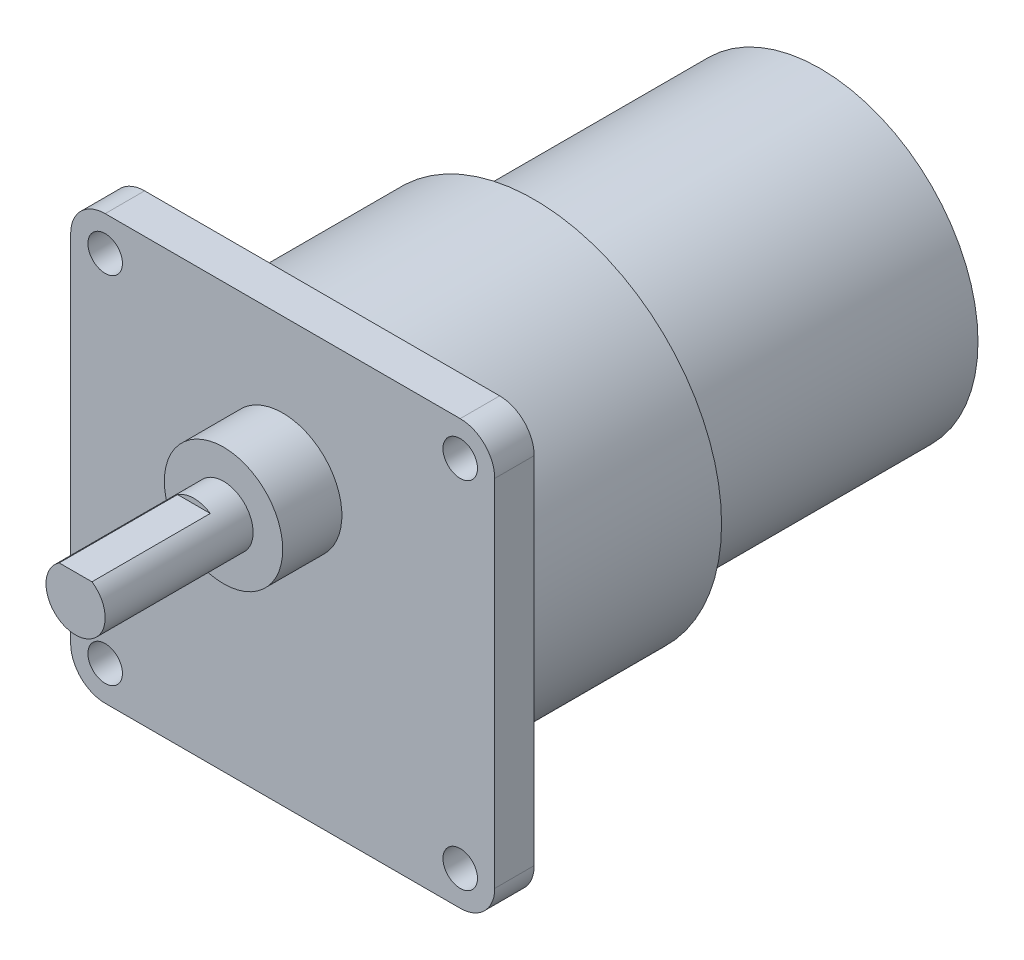
ISO-10303-21;
HEADER;
FILE_DESCRIPTION(('STEP AP214'),'2;1');
FILE_NAME('part.step','',(''),(''),'','','');
FILE_SCHEMA(('AUTOMOTIVE_DESIGN { 1 0 10303 214 1 1 1 1 }'));
ENDSEC;
DATA;
#1=APPLICATION_CONTEXT('core data for automotive mechanical design processes');
#2=APPLICATION_PROTOCOL_DEFINITION('international standard','automotive_design',2000,#1);
#3=PRODUCT_CONTEXT('',#1,'mechanical');
#4=PRODUCT('Part','Part','',(#3));
#5=PRODUCT_RELATED_PRODUCT_CATEGORY('part','',(#4));
#6=PRODUCT_DEFINITION_FORMATION('','',#4);
#7=PRODUCT_DEFINITION_CONTEXT('part definition',#1,'design');
#8=PRODUCT_DEFINITION('design','',#6,#7);
#9=PRODUCT_DEFINITION_SHAPE('','',#8);
#10=(LENGTH_UNIT() NAMED_UNIT(*) SI_UNIT(.MILLI.,.METRE.));
#11=(NAMED_UNIT(*) PLANE_ANGLE_UNIT() SI_UNIT($,.RADIAN.));
#12=(NAMED_UNIT(*) SI_UNIT($,.STERADIAN.) SOLID_ANGLE_UNIT());
#13=UNCERTAINTY_MEASURE_WITH_UNIT(LENGTH_MEASURE(1.E-05),#10,'distance_accuracy_value','');
#14=(GEOMETRIC_REPRESENTATION_CONTEXT(3) GLOBAL_UNCERTAINTY_ASSIGNED_CONTEXT((#13)) GLOBAL_UNIT_ASSIGNED_CONTEXT((#10,
#11,#12)) REPRESENTATION_CONTEXT('',''));
#15=CARTESIAN_POINT('',(0.,0.,0.));
#16=DIRECTION('',(0.,0.,1.));
#17=DIRECTION('',(1.,0.,0.));
#18=AXIS2_PLACEMENT_3D('',#15,#16,#17);
#19=CARTESIAN_POINT('',(21.5,-21.5,4.));
#20=DIRECTION('',(-1.,0.,0.));
#21=DIRECTION('',(0.,0.,1.));
#22=AXIS2_PLACEMENT_3D('',#19,#20,#21);
#23=PLANE('',#22);
#24=DIRECTION('',(0.,1.,0.));
#25=VECTOR('',#24,1.);
#26=CARTESIAN_POINT('',(21.5,-21.5,4.));
#27=LINE('',#26,#25);
#28=CARTESIAN_POINT('',(21.5,-18.,4.));
#29=VERTEX_POINT('',#28);
#30=CARTESIAN_POINT('',(21.5,18.,4.));
#31=VERTEX_POINT('',#30);
#32=EDGE_CURVE('E170',#29,#31,#27,.T.);
#33=ORIENTED_EDGE('',*,*,#32,.F.);
#34=DIRECTION('',(0.,0.,-1.));
#35=VECTOR('',#34,1.);
#36=CARTESIAN_POINT('',(21.5,-18.,4.));
#37=LINE('',#36,#35);
#38=CARTESIAN_POINT('',(21.5,-18.,0.));
#39=VERTEX_POINT('',#38);
#40=EDGE_CURVE('E193',#29,#39,#37,.T.);
#41=ORIENTED_EDGE('',*,*,#40,.T.);
#42=DIRECTION('',(0.,1.,0.));
#43=VECTOR('',#42,1.);
#44=CARTESIAN_POINT('',(21.5,-21.5,0.));
#45=LINE('',#44,#43);
#46=CARTESIAN_POINT('',(21.5,18.,0.));
#47=VERTEX_POINT('',#46);
#48=EDGE_CURVE('E167',#39,#47,#45,.T.);
#49=ORIENTED_EDGE('',*,*,#48,.T.);
#50=DIRECTION('',(0.,0.,-1.));
#51=VECTOR('',#50,1.);
#52=CARTESIAN_POINT('',(21.5,18.,4.));
#53=LINE('',#52,#51);
#54=EDGE_CURVE('E182',#47,#31,#53,.F.);
#55=ORIENTED_EDGE('',*,*,#54,.T.);
#56=EDGE_LOOP('',(#33,#41,#49,#55));
#57=FACE_BOUND('',#56,.T.);
#58=ADVANCED_FACE('F38',(#57),#23,.F.);
#59=CARTESIAN_POINT('',(-21.5,21.5,4.));
#60=DIRECTION('',(0.,-1.,0.));
#61=DIRECTION('',(0.,0.,-1.));
#62=AXIS2_PLACEMENT_3D('',#59,#60,#61);
#63=PLANE('',#62);
#64=DIRECTION('',(-1.,0.,0.));
#65=VECTOR('',#64,1.);
#66=CARTESIAN_POINT('',(-21.5,21.5,0.));
#67=LINE('',#66,#65);
#68=CARTESIAN_POINT('',(18.,21.5,0.));
#69=VERTEX_POINT('',#68);
#70=CARTESIAN_POINT('',(-18.,21.5,0.));
#71=VERTEX_POINT('',#70);
#72=EDGE_CURVE('E185',#69,#71,#67,.T.);
#73=ORIENTED_EDGE('',*,*,#72,.T.);
#74=DIRECTION('',(0.,0.,-1.));
#75=VECTOR('',#74,1.);
#76=CARTESIAN_POINT('',(-18.,21.5,4.));
#77=LINE('',#76,#75);
#78=CARTESIAN_POINT('',(-18.,21.5,4.));
#79=VERTEX_POINT('',#78);
#80=EDGE_CURVE('E223',#71,#79,#77,.F.);
#81=ORIENTED_EDGE('',*,*,#80,.T.);
#82=DIRECTION('',(-1.,0.,0.));
#83=VECTOR('',#82,1.);
#84=CARTESIAN_POINT('',(-21.5,21.5,4.));
#85=LINE('',#84,#83);
#86=CARTESIAN_POINT('',(18.,21.5,4.));
#87=VERTEX_POINT('',#86);
#88=EDGE_CURVE('E173',#87,#79,#85,.T.);
#89=ORIENTED_EDGE('',*,*,#88,.F.);
#90=DIRECTION('',(0.,0.,-1.));
#91=VECTOR('',#90,1.);
#92=CARTESIAN_POINT('',(18.,21.5,4.));
#93=LINE('',#92,#91);
#94=EDGE_CURVE('E221',#87,#69,#93,.T.);
#95=ORIENTED_EDGE('',*,*,#94,.T.);
#96=EDGE_LOOP('',(#73,#81,#89,#95));
#97=FACE_BOUND('',#96,.T.);
#98=ADVANCED_FACE('F265',(#97),#63,.F.);
#99=CARTESIAN_POINT('',(-21.5,-21.5,4.));
#100=DIRECTION('',(1.,0.,0.));
#101=DIRECTION('',(0.,0.,-1.));
#102=AXIS2_PLACEMENT_3D('',#99,#100,#101);
#103=PLANE('',#102);
#104=DIRECTION('',(0.,-1.,0.));
#105=VECTOR('',#104,1.);
#106=CARTESIAN_POINT('',(-21.5,-21.5,0.));
#107=LINE('',#106,#105);
#108=CARTESIAN_POINT('',(-21.5,18.,0.));
#109=VERTEX_POINT('',#108);
#110=CARTESIAN_POINT('',(-21.5,-18.,0.));
#111=VERTEX_POINT('',#110);
#112=EDGE_CURVE('E188',#109,#111,#107,.T.);
#113=ORIENTED_EDGE('',*,*,#112,.T.);
#114=DIRECTION('',(0.,0.,-1.));
#115=VECTOR('',#114,1.);
#116=CARTESIAN_POINT('',(-21.5,-18.,4.));
#117=LINE('',#116,#115);
#118=CARTESIAN_POINT('',(-21.5,-18.,4.));
#119=VERTEX_POINT('',#118);
#120=EDGE_CURVE('E63',#111,#119,#117,.F.);
#121=ORIENTED_EDGE('',*,*,#120,.T.);
#122=DIRECTION('',(0.,-1.,0.));
#123=VECTOR('',#122,1.);
#124=CARTESIAN_POINT('',(-21.5,-21.5,4.));
#125=LINE('',#124,#123);
#126=CARTESIAN_POINT('',(-21.5,18.,4.));
#127=VERTEX_POINT('',#126);
#128=EDGE_CURVE('E177',#127,#119,#125,.T.);
#129=ORIENTED_EDGE('',*,*,#128,.F.);
#130=DIRECTION('',(0.,0.,-1.));
#131=VECTOR('',#130,1.);
#132=CARTESIAN_POINT('',(-21.5,18.,4.));
#133=LINE('',#132,#131);
#134=EDGE_CURVE('E217',#127,#109,#133,.T.);
#135=ORIENTED_EDGE('',*,*,#134,.T.);
#136=EDGE_LOOP('',(#113,#121,#129,#135));
#137=FACE_BOUND('',#136,.T.);
#138=ADVANCED_FACE('F271',(#137),#103,.F.);
#139=CARTESIAN_POINT('',(-21.5,-21.5,4.));
#140=DIRECTION('',(0.,1.,0.));
#141=DIRECTION('',(0.,0.,1.));
#142=AXIS2_PLACEMENT_3D('',#139,#140,#141);
#143=PLANE('',#142);
#144=DIRECTION('',(1.,0.,0.));
#145=VECTOR('',#144,1.);
#146=CARTESIAN_POINT('',(-21.5,-21.5,0.));
#147=LINE('',#146,#145);
#148=CARTESIAN_POINT('',(-18.,-21.5,0.));
#149=VERTEX_POINT('',#148);
#150=CARTESIAN_POINT('',(18.,-21.5,0.));
#151=VERTEX_POINT('',#150);
#152=EDGE_CURVE('E174',#149,#151,#147,.T.);
#153=ORIENTED_EDGE('',*,*,#152,.T.);
#154=DIRECTION('',(0.,0.,-1.));
#155=VECTOR('',#154,1.);
#156=CARTESIAN_POINT('',(18.,-21.5,4.));
#157=LINE('',#156,#155);
#158=CARTESIAN_POINT('',(18.,-21.5,4.));
#159=VERTEX_POINT('',#158);
#160=EDGE_CURVE('E207',#151,#159,#157,.F.);
#161=ORIENTED_EDGE('',*,*,#160,.T.);
#162=DIRECTION('',(1.,0.,0.));
#163=VECTOR('',#162,1.);
#164=CARTESIAN_POINT('',(-21.5,-21.5,4.));
#165=LINE('',#164,#163);
#166=CARTESIAN_POINT('',(-18.,-21.5,4.));
#167=VERTEX_POINT('',#166);
#168=EDGE_CURVE('E179',#167,#159,#165,.T.);
#169=ORIENTED_EDGE('',*,*,#168,.F.);
#170=DIRECTION('',(0.,0.,-1.));
#171=VECTOR('',#170,1.);
#172=CARTESIAN_POINT('',(-18.,-21.5,4.));
#173=LINE('',#172,#171);
#174=EDGE_CURVE('E204',#167,#149,#173,.T.);
#175=ORIENTED_EDGE('',*,*,#174,.T.);
#176=EDGE_LOOP('',(#153,#161,#169,#175));
#177=FACE_BOUND('',#176,.T.);
#178=ADVANCED_FACE('F236',(#177),#143,.F.);
#179=CARTESIAN_POINT('',(0.,0.,4.));
#180=DIRECTION('',(0.,0.,-1.));
#181=DIRECTION('',(-1.,0.,0.));
#182=AXIS2_PLACEMENT_3D('',#179,#180,#181);
#183=PLANE('',#182);
#184=CARTESIAN_POINT('',(0.,7.,4.));
#185=DIRECTION('',(0.,0.,-1.));
#186=DIRECTION('',(-1.,0.,0.));
#187=AXIS2_PLACEMENT_3D('',#184,#185,#186);
#188=CIRCLE('',#187,6.);
#189=CARTESIAN_POINT('',(-6.,7.,4.));
#190=VERTEX_POINT('',#189);
#191=EDGE_CURVE('E42',#190,#190,#188,.F.);
#192=ORIENTED_EDGE('',*,*,#191,.F.);
#193=EDGE_LOOP('',(#192));
#194=FACE_BOUND('',#193,.T.);
#195=CARTESIAN_POINT('',(-18.,18.,4.));
#196=DIRECTION('',(0.,0.,1.));
#197=DIRECTION('',(-1.,0.,0.));
#198=AXIS2_PLACEMENT_3D('',#195,#196,#197);
#199=CIRCLE('',#198,1.75);
#200=CARTESIAN_POINT('',(-19.75,18.,4.));
#201=VERTEX_POINT('',#200);
#202=EDGE_CURVE('E156',#201,#201,#199,.T.);
#203=ORIENTED_EDGE('',*,*,#202,.F.);
#204=EDGE_LOOP('',(#203));
#205=FACE_BOUND('',#204,.T.);
#206=CARTESIAN_POINT('',(17.9999999999999,-18.,4.));
#207=DIRECTION('',(0.,0.,1.));
#208=DIRECTION('',(-1.,0.,0.));
#209=AXIS2_PLACEMENT_3D('',#206,#207,#208);
#210=CIRCLE('',#209,1.75);
#211=CARTESIAN_POINT('',(16.2499999999999,-18.,4.));
#212=VERTEX_POINT('',#211);
#213=EDGE_CURVE('E149',#212,#212,#210,.T.);
#214=ORIENTED_EDGE('',*,*,#213,.F.);
#215=EDGE_LOOP('',(#214));
#216=FACE_BOUND('',#215,.T.);
#217=CARTESIAN_POINT('',(-18.,-18.,4.));
#218=DIRECTION('',(0.,0.,1.));
#219=DIRECTION('',(1.,0.,0.));
#220=AXIS2_PLACEMENT_3D('',#217,#218,#219);
#221=CIRCLE('',#220,1.75);
#222=CARTESIAN_POINT('',(-16.25,-18.,4.));
#223=VERTEX_POINT('',#222);
#224=EDGE_CURVE('E145',#223,#223,#221,.T.);
#225=ORIENTED_EDGE('',*,*,#224,.F.);
#226=EDGE_LOOP('',(#225));
#227=FACE_BOUND('',#226,.T.);
#228=CARTESIAN_POINT('',(18.,18.,4.));
#229=DIRECTION('',(0.,0.,1.));
#230=DIRECTION('',(1.,0.,0.));
#231=AXIS2_PLACEMENT_3D('',#228,#229,#230);
#232=CIRCLE('',#231,1.75);
#233=CARTESIAN_POINT('',(19.75,18.,4.));
#234=VERTEX_POINT('',#233);
#235=EDGE_CURVE('E155',#234,#234,#232,.T.);
#236=ORIENTED_EDGE('',*,*,#235,.F.);
#237=EDGE_LOOP('',(#236));
#238=FACE_BOUND('',#237,.T.);
#239=ORIENTED_EDGE('',*,*,#168,.T.);
#240=CARTESIAN_POINT('',(18.,-18.,4.));
#241=DIRECTION('',(0.,0.,-1.));
#242=DIRECTION('',(-1.,0.,0.));
#243=AXIS2_PLACEMENT_3D('',#240,#241,#242);
#244=CIRCLE('',#243,3.5);
#245=EDGE_CURVE('E215',#159,#29,#244,.F.);
#246=ORIENTED_EDGE('',*,*,#245,.T.);
#247=ORIENTED_EDGE('',*,*,#32,.T.);
#248=CARTESIAN_POINT('',(18.,18.,4.));
#249=DIRECTION('',(0.,0.,-1.));
#250=DIRECTION('',(-1.,0.,0.));
#251=AXIS2_PLACEMENT_3D('',#248,#249,#250);
#252=CIRCLE('',#251,3.5);
#253=EDGE_CURVE('E209',#31,#87,#252,.F.);
#254=ORIENTED_EDGE('',*,*,#253,.T.);
#255=ORIENTED_EDGE('',*,*,#88,.T.);
#256=CARTESIAN_POINT('',(-18.,18.,4.));
#257=DIRECTION('',(0.,0.,-1.));
#258=DIRECTION('',(-1.,0.,0.));
#259=AXIS2_PLACEMENT_3D('',#256,#257,#258);
#260=CIRCLE('',#259,3.5);
#261=EDGE_CURVE('E211',#79,#127,#260,.F.);
#262=ORIENTED_EDGE('',*,*,#261,.T.);
#263=ORIENTED_EDGE('',*,*,#128,.T.);
#264=CARTESIAN_POINT('',(-18.,-18.,4.));
#265=DIRECTION('',(0.,0.,-1.));
#266=DIRECTION('',(-1.,0.,0.));
#267=AXIS2_PLACEMENT_3D('',#264,#265,#266);
#268=CIRCLE('',#267,3.5);
#269=EDGE_CURVE('E213',#119,#167,#268,.F.);
#270=ORIENTED_EDGE('',*,*,#269,.T.);
#271=EDGE_LOOP('',(#239,#246,#247,#254,#255,#262,#263,#270));
#272=FACE_BOUND('',#271,.T.);
#273=ADVANCED_FACE('F232',(#194,#205,#216,#227,#238,#272),#183,.F.);
#274=CARTESIAN_POINT('',(0.,0.,0.));
#275=DIRECTION('',(0.,0.,-1.));
#276=DIRECTION('',(-1.,0.,0.));
#277=AXIS2_PLACEMENT_3D('',#274,#275,#276);
#278=PLANE('',#277);
#279=CARTESIAN_POINT('',(0.,0.,0.));
#280=DIRECTION('',(0.,0.,-1.));
#281=DIRECTION('',(-1.,0.,0.));
#282=AXIS2_PLACEMENT_3D('',#279,#280,#281);
#283=CIRCLE('',#282,19.);
#284=CARTESIAN_POINT('',(-19.,0.,0.));
#285=VERTEX_POINT('',#284);
#286=EDGE_CURVE('E319',#285,#285,#283,.T.);
#287=ORIENTED_EDGE('',*,*,#286,.F.);
#288=EDGE_LOOP('',(#287));
#289=FACE_BOUND('',#288,.T.);
#290=CARTESIAN_POINT('',(-18.,18.,0.));
#291=DIRECTION('',(0.,0.,1.));
#292=DIRECTION('',(-1.,0.,0.));
#293=AXIS2_PLACEMENT_3D('',#290,#291,#292);
#294=CIRCLE('',#293,1.75);
#295=CARTESIAN_POINT('',(-19.75,18.,0.));
#296=VERTEX_POINT('',#295);
#297=EDGE_CURVE('E152',#296,#296,#294,.T.);
#298=ORIENTED_EDGE('',*,*,#297,.T.);
#299=EDGE_LOOP('',(#298));
#300=FACE_BOUND('',#299,.T.);
#301=CARTESIAN_POINT('',(17.9999999999999,-18.,0.));
#302=DIRECTION('',(0.,0.,1.));
#303=DIRECTION('',(-1.,0.,0.));
#304=AXIS2_PLACEMENT_3D('',#301,#302,#303);
#305=CIRCLE('',#304,1.75);
#306=CARTESIAN_POINT('',(16.2499999999999,-18.,0.));
#307=VERTEX_POINT('',#306);
#308=EDGE_CURVE('E159',#307,#307,#305,.T.);
#309=ORIENTED_EDGE('',*,*,#308,.T.);
#310=EDGE_LOOP('',(#309));
#311=FACE_BOUND('',#310,.T.);
#312=CARTESIAN_POINT('',(-18.,-18.,0.));
#313=DIRECTION('',(0.,0.,1.));
#314=DIRECTION('',(1.,0.,0.));
#315=AXIS2_PLACEMENT_3D('',#312,#313,#314);
#316=CIRCLE('',#315,1.75);
#317=CARTESIAN_POINT('',(-16.25,-18.,0.));
#318=VERTEX_POINT('',#317);
#319=EDGE_CURVE('E146',#318,#318,#316,.T.);
#320=ORIENTED_EDGE('',*,*,#319,.T.);
#321=EDGE_LOOP('',(#320));
#322=FACE_BOUND('',#321,.T.);
#323=CARTESIAN_POINT('',(18.,18.,0.));
#324=DIRECTION('',(0.,0.,1.));
#325=DIRECTION('',(1.,0.,0.));
#326=AXIS2_PLACEMENT_3D('',#323,#324,#325);
#327=CIRCLE('',#326,1.75);
#328=CARTESIAN_POINT('',(19.75,18.,0.));
#329=VERTEX_POINT('',#328);
#330=EDGE_CURVE('E164',#329,#329,#327,.T.);
#331=ORIENTED_EDGE('',*,*,#330,.T.);
#332=EDGE_LOOP('',(#331));
#333=FACE_BOUND('',#332,.T.);
#334=ORIENTED_EDGE('',*,*,#48,.F.);
#335=CARTESIAN_POINT('',(18.,-18.,0.));
#336=DIRECTION('',(0.,0.,-1.));
#337=DIRECTION('',(-1.,0.,0.));
#338=AXIS2_PLACEMENT_3D('',#335,#336,#337);
#339=CIRCLE('',#338,3.5);
#340=EDGE_CURVE('E202',#39,#151,#339,.T.);
#341=ORIENTED_EDGE('',*,*,#340,.T.);
#342=ORIENTED_EDGE('',*,*,#152,.F.);
#343=CARTESIAN_POINT('',(-18.,-18.,0.));
#344=DIRECTION('',(0.,0.,-1.));
#345=DIRECTION('',(-1.,0.,0.));
#346=AXIS2_PLACEMENT_3D('',#343,#344,#345);
#347=CIRCLE('',#346,3.5);
#348=EDGE_CURVE('E200',#149,#111,#347,.T.);
#349=ORIENTED_EDGE('',*,*,#348,.T.);
#350=ORIENTED_EDGE('',*,*,#112,.F.);
#351=CARTESIAN_POINT('',(-18.,18.,0.));
#352=DIRECTION('',(0.,0.,-1.));
#353=DIRECTION('',(-1.,0.,0.));
#354=AXIS2_PLACEMENT_3D('',#351,#352,#353);
#355=CIRCLE('',#354,3.5);
#356=EDGE_CURVE('E198',#109,#71,#355,.T.);
#357=ORIENTED_EDGE('',*,*,#356,.T.);
#358=ORIENTED_EDGE('',*,*,#72,.F.);
#359=CARTESIAN_POINT('',(18.,18.,0.));
#360=DIRECTION('',(0.,0.,-1.));
#361=DIRECTION('',(-1.,0.,0.));
#362=AXIS2_PLACEMENT_3D('',#359,#360,#361);
#363=CIRCLE('',#362,3.5);
#364=EDGE_CURVE('E196',#69,#47,#363,.T.);
#365=ORIENTED_EDGE('',*,*,#364,.T.);
#366=EDGE_LOOP('',(#334,#341,#342,#349,#350,#357,#358,#365));
#367=FACE_BOUND('',#366,.T.);
#368=ADVANCED_FACE('F235',(#289,#300,#311,#322,#333,#367),#278,.T.);
#369=CARTESIAN_POINT('',(18.,-18.,4.));
#370=DIRECTION('',(0.,0.,-1.));
#371=DIRECTION('',(-1.,0.,0.));
#372=AXIS2_PLACEMENT_3D('',#369,#370,#371);
#373=CYLINDRICAL_SURFACE('',#372,3.5);
#374=ORIENTED_EDGE('',*,*,#245,.F.);
#375=ORIENTED_EDGE('',*,*,#160,.F.);
#376=ORIENTED_EDGE('',*,*,#340,.F.);
#377=ORIENTED_EDGE('',*,*,#40,.F.);
#378=EDGE_LOOP('',(#374,#375,#376,#377));
#379=FACE_BOUND('',#378,.T.);
#380=ADVANCED_FACE('F255',(#379),#373,.T.);
#381=CARTESIAN_POINT('',(-18.,-18.,4.));
#382=DIRECTION('',(0.,0.,-1.));
#383=DIRECTION('',(-1.,0.,0.));
#384=AXIS2_PLACEMENT_3D('',#381,#382,#383);
#385=CYLINDRICAL_SURFACE('',#384,3.5);
#386=ORIENTED_EDGE('',*,*,#269,.F.);
#387=ORIENTED_EDGE('',*,*,#120,.F.);
#388=ORIENTED_EDGE('',*,*,#348,.F.);
#389=ORIENTED_EDGE('',*,*,#174,.F.);
#390=EDGE_LOOP('',(#386,#387,#388,#389));
#391=FACE_BOUND('',#390,.T.);
#392=ADVANCED_FACE('F273',(#391),#385,.T.);
#393=CARTESIAN_POINT('',(-18.,18.,4.));
#394=DIRECTION('',(0.,0.,-1.));
#395=DIRECTION('',(-1.,0.,0.));
#396=AXIS2_PLACEMENT_3D('',#393,#394,#395);
#397=CYLINDRICAL_SURFACE('',#396,3.5);
#398=ORIENTED_EDGE('',*,*,#261,.F.);
#399=ORIENTED_EDGE('',*,*,#80,.F.);
#400=ORIENTED_EDGE('',*,*,#356,.F.);
#401=ORIENTED_EDGE('',*,*,#134,.F.);
#402=EDGE_LOOP('',(#398,#399,#400,#401));
#403=FACE_BOUND('',#402,.T.);
#404=ADVANCED_FACE('F269',(#403),#397,.T.);
#405=CARTESIAN_POINT('',(18.,18.,4.));
#406=DIRECTION('',(0.,0.,-1.));
#407=DIRECTION('',(-1.,0.,0.));
#408=AXIS2_PLACEMENT_3D('',#405,#406,#407);
#409=CYLINDRICAL_SURFACE('',#408,3.5);
#410=ORIENTED_EDGE('',*,*,#253,.F.);
#411=ORIENTED_EDGE('',*,*,#54,.F.);
#412=ORIENTED_EDGE('',*,*,#364,.F.);
#413=ORIENTED_EDGE('',*,*,#94,.F.);
#414=EDGE_LOOP('',(#410,#411,#412,#413));
#415=FACE_BOUND('',#414,.T.);
#416=ADVANCED_FACE('F40',(#415),#409,.T.);
#417=CARTESIAN_POINT('',(18.,18.,0.));
#418=DIRECTION('',(0.,0.,1.));
#419=DIRECTION('',(1.,0.,0.));
#420=AXIS2_PLACEMENT_3D('',#417,#418,#419);
#421=CYLINDRICAL_SURFACE('',#420,1.75);
#422=ORIENTED_EDGE('',*,*,#330,.F.);
#423=EDGE_LOOP('',(#422));
#424=FACE_BOUND('',#423,.T.);
#425=ORIENTED_EDGE('',*,*,#235,.T.);
#426=EDGE_LOOP('',(#425));
#427=FACE_BOUND('',#426,.T.);
#428=ADVANCED_FACE('F295',(#424,#427),#421,.F.);
#429=CARTESIAN_POINT('',(-18.,-18.,0.));
#430=DIRECTION('',(0.,0.,1.));
#431=DIRECTION('',(1.,0.,0.));
#432=AXIS2_PLACEMENT_3D('',#429,#430,#431);
#433=CYLINDRICAL_SURFACE('',#432,1.75);
#434=ORIENTED_EDGE('',*,*,#319,.F.);
#435=EDGE_LOOP('',(#434));
#436=FACE_BOUND('',#435,.T.);
#437=ORIENTED_EDGE('',*,*,#224,.T.);
#438=EDGE_LOOP('',(#437));
#439=FACE_BOUND('',#438,.T.);
#440=ADVANCED_FACE('F299',(#436,#439),#433,.F.);
#441=CARTESIAN_POINT('',(17.9999999999999,-18.,0.));
#442=DIRECTION('',(0.,0.,1.));
#443=DIRECTION('',(1.,0.,0.));
#444=AXIS2_PLACEMENT_3D('',#441,#442,#443);
#445=CYLINDRICAL_SURFACE('',#444,1.75);
#446=ORIENTED_EDGE('',*,*,#308,.F.);
#447=EDGE_LOOP('',(#446));
#448=FACE_BOUND('',#447,.T.);
#449=ORIENTED_EDGE('',*,*,#213,.T.);
#450=EDGE_LOOP('',(#449));
#451=FACE_BOUND('',#450,.T.);
#452=ADVANCED_FACE('F305',(#448,#451),#445,.F.);
#453=CARTESIAN_POINT('',(-18.,18.,0.));
#454=DIRECTION('',(0.,0.,1.));
#455=DIRECTION('',(1.,0.,0.));
#456=AXIS2_PLACEMENT_3D('',#453,#454,#455);
#457=CYLINDRICAL_SURFACE('',#456,1.75);
#458=ORIENTED_EDGE('',*,*,#297,.F.);
#459=EDGE_LOOP('',(#458));
#460=FACE_BOUND('',#459,.T.);
#461=ORIENTED_EDGE('',*,*,#202,.T.);
#462=EDGE_LOOP('',(#461));
#463=FACE_BOUND('',#462,.T.);
#464=ADVANCED_FACE('F330',(#460,#463),#457,.F.);
#465=CARTESIAN_POINT('',(0.,7.,10.));
#466=DIRECTION('',(0.,0.,-1.));
#467=DIRECTION('',(-1.,0.,0.));
#468=AXIS2_PLACEMENT_3D('',#465,#466,#467);
#469=CYLINDRICAL_SURFACE('',#468,6.);
#470=CARTESIAN_POINT('',(0.,7.,10.));
#471=DIRECTION('',(0.,0.,1.));
#472=DIRECTION('',(1.,0.,0.));
#473=AXIS2_PLACEMENT_3D('',#470,#471,#472);
#474=CIRCLE('',#473,6.);
#475=CARTESIAN_POINT('',(6.,7.,10.));
#476=VERTEX_POINT('',#475);
#477=EDGE_CURVE('E140',#476,#476,#474,.T.);
#478=ORIENTED_EDGE('',*,*,#477,.F.);
#479=EDGE_LOOP('',(#478));
#480=FACE_BOUND('',#479,.T.);
#481=ORIENTED_EDGE('',*,*,#191,.T.);
#482=EDGE_LOOP('',(#481));
#483=FACE_BOUND('',#482,.T.);
#484=ADVANCED_FACE('F230',(#480,#483),#469,.T.);
#485=CARTESIAN_POINT('',(0.,7.,10.));
#486=DIRECTION('',(0.,0.,1.));
#487=DIRECTION('',(1.,0.,0.));
#488=AXIS2_PLACEMENT_3D('',#485,#486,#487);
#489=PLANE('',#488);
#490=CARTESIAN_POINT('',(0.,7.,10.));
#491=DIRECTION('',(0.,0.,1.));
#492=DIRECTION('',(1.,0.,0.));
#493=AXIS2_PLACEMENT_3D('',#490,#491,#492);
#494=CIRCLE('',#493,3.);
#495=CARTESIAN_POINT('',(3.,7.,10.));
#496=VERTEX_POINT('',#495);
#497=EDGE_CURVE('E47',#496,#496,#494,.T.);
#498=ORIENTED_EDGE('',*,*,#497,.F.);
#499=EDGE_LOOP('',(#498));
#500=FACE_BOUND('',#499,.T.);
#501=ORIENTED_EDGE('',*,*,#477,.T.);
#502=EDGE_LOOP('',(#501));
#503=FACE_BOUND('',#502,.T.);
#504=ADVANCED_FACE('F338',(#500,#503),#489,.T.);
#505=CARTESIAN_POINT('',(0.,7.,25.));
#506=DIRECTION('',(0.,0.,-1.));
#507=DIRECTION('',(-1.,0.,0.));
#508=AXIS2_PLACEMENT_3D('',#505,#506,#507);
#509=CYLINDRICAL_SURFACE('',#508,3.);
#510=CARTESIAN_POINT('',(0.,7.,25.));
#511=DIRECTION('',(0.,0.,1.));
#512=DIRECTION('',(1.,0.,0.));
#513=AXIS2_PLACEMENT_3D('',#510,#511,#512);
#514=CIRCLE('',#513,3.);
#515=CARTESIAN_POINT('',(-1.6583123951777,9.5,25.));
#516=VERTEX_POINT('',#515);
#517=CARTESIAN_POINT('',(1.6583123951777,9.5,25.));
#518=VERTEX_POINT('',#517);
#519=EDGE_CURVE('E134',#516,#518,#514,.T.);
#520=ORIENTED_EDGE('',*,*,#519,.F.);
#521=DIRECTION('',(0.,0.,1.));
#522=VECTOR('',#521,1.);
#523=CARTESIAN_POINT('',(-1.6583123951777,9.5,13.));
#524=LINE('',#523,#522);
#525=CARTESIAN_POINT('',(-1.6583123951777,9.5,13.));
#526=VERTEX_POINT('',#525);
#527=EDGE_CURVE('E55',#526,#516,#524,.T.);
#528=ORIENTED_EDGE('',*,*,#527,.F.);
#529=CARTESIAN_POINT('',(0.,7.,13.));
#530=DIRECTION('',(0.,0.,1.));
#531=DIRECTION('',(1.,0.,0.));
#532=AXIS2_PLACEMENT_3D('',#529,#530,#531);
#533=CIRCLE('',#532,3.);
#534=CARTESIAN_POINT('',(1.6583123951777,9.5,13.));
#535=VERTEX_POINT('',#534);
#536=EDGE_CURVE('E120',#535,#526,#533,.T.);
#537=ORIENTED_EDGE('',*,*,#536,.F.);
#538=DIRECTION('',(0.,0.,1.));
#539=VECTOR('',#538,1.);
#540=CARTESIAN_POINT('',(1.6583123951777,9.5,13.));
#541=LINE('',#540,#539);
#542=EDGE_CURVE('E128',#535,#518,#541,.T.);
#543=ORIENTED_EDGE('',*,*,#542,.T.);
#544=EDGE_LOOP('',(#520,#528,#537,#543));
#545=FACE_BOUND('',#544,.T.);
#546=ORIENTED_EDGE('',*,*,#497,.T.);
#547=EDGE_LOOP('',(#546));
#548=FACE_BOUND('',#547,.T.);
#549=ADVANCED_FACE('F131',(#545,#548),#509,.T.);
#550=CARTESIAN_POINT('',(0.,7.,25.));
#551=DIRECTION('',(0.,0.,1.));
#552=DIRECTION('',(1.,0.,0.));
#553=AXIS2_PLACEMENT_3D('',#550,#551,#552);
#554=PLANE('',#553);
#555=DIRECTION('',(1.,0.,0.));
#556=VECTOR('',#555,1.);
#557=CARTESIAN_POINT('',(-1.6583123951777,9.5,25.));
#558=LINE('',#557,#556);
#559=EDGE_CURVE('E125',#516,#518,#558,.T.);
#560=ORIENTED_EDGE('',*,*,#559,.F.);
#561=ORIENTED_EDGE('',*,*,#519,.T.);
#562=EDGE_LOOP('',(#560,#561));
#563=FACE_BOUND('',#562,.T.);
#564=ADVANCED_FACE('F348',(#563),#554,.T.);
#565=CARTESIAN_POINT('',(-1.6583123951777,9.5,13.));
#566=DIRECTION('',(0.,-1.,0.));
#567=DIRECTION('',(0.,0.,-1.));
#568=AXIS2_PLACEMENT_3D('',#565,#566,#567);
#569=PLANE('',#568);
#570=ORIENTED_EDGE('',*,*,#559,.T.);
#571=ORIENTED_EDGE('',*,*,#542,.F.);
#572=DIRECTION('',(1.,0.,0.));
#573=VECTOR('',#572,1.);
#574=CARTESIAN_POINT('',(-1.6583123951777,9.5,13.));
#575=LINE('',#574,#573);
#576=EDGE_CURVE('E122',#526,#535,#575,.T.);
#577=ORIENTED_EDGE('',*,*,#576,.F.);
#578=ORIENTED_EDGE('',*,*,#527,.T.);
#579=EDGE_LOOP('',(#570,#571,#577,#578));
#580=FACE_BOUND('',#579,.T.);
#581=ADVANCED_FACE('F127',(#580),#569,.F.);
#582=CARTESIAN_POINT('',(0.,7.,13.));
#583=DIRECTION('',(0.,0.,1.));
#584=DIRECTION('',(1.,0.,0.));
#585=AXIS2_PLACEMENT_3D('',#582,#583,#584);
#586=PLANE('',#585);
#587=ORIENTED_EDGE('',*,*,#536,.T.);
#588=ORIENTED_EDGE('',*,*,#576,.T.);
#589=EDGE_LOOP('',(#587,#588));
#590=FACE_BOUND('',#589,.T.);
#591=ADVANCED_FACE('F121',(#590),#586,.T.);
#592=CARTESIAN_POINT('',(0.,0.,-21.5));
#593=DIRECTION('',(0.,0.,1.));
#594=DIRECTION('',(1.,0.,0.));
#595=AXIS2_PLACEMENT_3D('',#592,#593,#594);
#596=CYLINDRICAL_SURFACE('',#595,19.);
#597=CARTESIAN_POINT('',(0.,0.,-21.5));
#598=DIRECTION('',(0.,0.,-1.));
#599=DIRECTION('',(-1.,0.,0.));
#600=AXIS2_PLACEMENT_3D('',#597,#598,#599);
#601=CIRCLE('',#600,19.);
#602=CARTESIAN_POINT('',(-19.,0.,-21.5));
#603=VERTEX_POINT('',#602);
#604=EDGE_CURVE('E377',#603,#603,#601,.T.);
#605=ORIENTED_EDGE('',*,*,#604,.F.);
#606=EDGE_LOOP('',(#605));
#607=FACE_BOUND('',#606,.T.);
#608=ORIENTED_EDGE('',*,*,#286,.T.);
#609=EDGE_LOOP('',(#608));
#610=FACE_BOUND('',#609,.T.);
#611=ADVANCED_FACE('F356',(#607,#610),#596,.T.);
#612=CARTESIAN_POINT('',(0.,0.,-21.5));
#613=DIRECTION('',(0.,0.,-1.));
#614=DIRECTION('',(-1.,0.,0.));
#615=AXIS2_PLACEMENT_3D('',#612,#613,#614);
#616=PLANE('',#615);
#617=CARTESIAN_POINT('',(0.,0.,-21.5));
#618=DIRECTION('',(0.,0.,-1.));
#619=DIRECTION('',(-1.,0.,0.));
#620=AXIS2_PLACEMENT_3D('',#617,#618,#619);
#621=CIRCLE('',#620,16.);
#622=CARTESIAN_POINT('',(16.,0.,-21.5));
#623=VERTEX_POINT('',#622);
#624=EDGE_CURVE('E11',#623,#623,#621,.T.);
#625=ORIENTED_EDGE('',*,*,#624,.F.);
#626=EDGE_LOOP('',(#625));
#627=FACE_BOUND('',#626,.T.);
#628=ORIENTED_EDGE('',*,*,#604,.T.);
#629=EDGE_LOOP('',(#628));
#630=FACE_BOUND('',#629,.T.);
#631=ADVANCED_FACE('F359',(#627,#630),#616,.T.);
#632=CARTESIAN_POINT('',(0.,0.,-50.5));
#633=DIRECTION('',(0.,0.,1.));
#634=DIRECTION('',(1.,0.,0.));
#635=AXIS2_PLACEMENT_3D('',#632,#633,#634);
#636=CYLINDRICAL_SURFACE('',#635,16.);
#637=CARTESIAN_POINT('',(0.,0.,-50.5));
#638=DIRECTION('',(0.,0.,-1.));
#639=DIRECTION('',(-1.,0.,0.));
#640=AXIS2_PLACEMENT_3D('',#637,#638,#639);
#641=CIRCLE('',#640,16.);
#642=CARTESIAN_POINT('',(16.,0.,-50.5));
#643=VERTEX_POINT('',#642);
#644=EDGE_CURVE('E375',#643,#643,#641,.T.);
#645=CARTESIAN_POINT('',(16.,0.,-50.5));
#646=CARTESIAN_POINT('',(16.,0.,-50.1979166666667));
#647=CARTESIAN_POINT('',(16.,0.,-49.8958333333333));
#648=CARTESIAN_POINT('',(16.,0.,-49.2916666666667));
#649=CARTESIAN_POINT('',(16.,0.,-48.9895833333333));
#650=CARTESIAN_POINT('',(16.,0.,-48.3854166666667));
#651=CARTESIAN_POINT('',(16.,0.,-48.0833333333333));
#652=CARTESIAN_POINT('',(16.,0.,-47.4791666666667));
#653=CARTESIAN_POINT('',(16.,0.,-47.1770833333333));
#654=CARTESIAN_POINT('',(16.,0.,-46.5729166666667));
#655=CARTESIAN_POINT('',(16.,0.,-46.2708333333333));
#656=CARTESIAN_POINT('',(16.,0.,-45.6666666666667));
#657=CARTESIAN_POINT('',(16.,0.,-45.3645833333333));
#658=CARTESIAN_POINT('',(16.,0.,-44.7604166666667));
#659=CARTESIAN_POINT('',(16.,0.,-44.4583333333333));
#660=CARTESIAN_POINT('',(16.,0.,-43.8541666666667));
#661=CARTESIAN_POINT('',(16.,0.,-43.5520833333333));
#662=CARTESIAN_POINT('',(16.,0.,-42.9479166666667));
#663=CARTESIAN_POINT('',(16.,0.,-42.6458333333333));
#664=CARTESIAN_POINT('',(16.,0.,-42.0416666666667));
#665=CARTESIAN_POINT('',(16.,0.,-41.7395833333333));
#666=CARTESIAN_POINT('',(16.,0.,-41.1354166666667));
#667=CARTESIAN_POINT('',(16.,0.,-40.8333333333333));
#668=CARTESIAN_POINT('',(16.,0.,-40.2291666666667));
#669=CARTESIAN_POINT('',(16.,0.,-39.9270833333333));
#670=CARTESIAN_POINT('',(16.,0.,-39.3229166666667));
#671=CARTESIAN_POINT('',(16.,0.,-39.0208333333333));
#672=CARTESIAN_POINT('',(16.,0.,-38.4166666666667));
#673=CARTESIAN_POINT('',(16.,0.,-38.1145833333333));
#674=CARTESIAN_POINT('',(16.,0.,-37.5104166666667));
#675=CARTESIAN_POINT('',(16.,0.,-37.2083333333333));
#676=CARTESIAN_POINT('',(16.,0.,-36.6041666666667));
#677=CARTESIAN_POINT('',(16.,0.,-36.3020833333333));
#678=CARTESIAN_POINT('',(16.,0.,-35.6979166666667));
#679=CARTESIAN_POINT('',(16.,0.,-35.3958333333333));
#680=CARTESIAN_POINT('',(16.,0.,-34.7916666666667));
#681=CARTESIAN_POINT('',(16.,0.,-34.4895833333333));
#682=CARTESIAN_POINT('',(16.,0.,-33.8854166666667));
#683=CARTESIAN_POINT('',(16.,0.,-33.5833333333333));
#684=CARTESIAN_POINT('',(16.,0.,-32.9791666666667));
#685=CARTESIAN_POINT('',(16.,0.,-32.6770833333333));
#686=CARTESIAN_POINT('',(16.,0.,-32.0729166666667));
#687=CARTESIAN_POINT('',(16.,0.,-31.7708333333333));
#688=CARTESIAN_POINT('',(16.,0.,-31.1666666666667));
#689=CARTESIAN_POINT('',(16.,0.,-30.8645833333333));
#690=CARTESIAN_POINT('',(16.,0.,-30.2604166666667));
#691=CARTESIAN_POINT('',(16.,0.,-29.9583333333333));
#692=CARTESIAN_POINT('',(16.,0.,-29.3541666666667));
#693=CARTESIAN_POINT('',(16.,0.,-29.0520833333333));
#694=CARTESIAN_POINT('',(16.,0.,-28.4479166666667));
#695=CARTESIAN_POINT('',(16.,0.,-28.1458333333333));
#696=CARTESIAN_POINT('',(16.,0.,-27.5416666666667));
#697=CARTESIAN_POINT('',(16.,0.,-27.2395833333333));
#698=CARTESIAN_POINT('',(16.,0.,-26.6354166666667));
#699=CARTESIAN_POINT('',(16.,0.,-26.3333333333333));
#700=CARTESIAN_POINT('',(16.,0.,-25.7291666666667));
#701=CARTESIAN_POINT('',(16.,0.,-25.4270833333333));
#702=CARTESIAN_POINT('',(16.,0.,-24.8229166666667));
#703=CARTESIAN_POINT('',(16.,0.,-24.5208333333333));
#704=CARTESIAN_POINT('',(16.,0.,-23.9166666666667));
#705=CARTESIAN_POINT('',(16.,0.,-23.6145833333333));
#706=CARTESIAN_POINT('',(16.,0.,-23.0104166666667));
#707=CARTESIAN_POINT('',(16.,0.,-22.7083333333333));
#708=CARTESIAN_POINT('',(16.,0.,-22.1041666666667));
#709=CARTESIAN_POINT('',(16.,0.,-21.8020833333333));
#710=CARTESIAN_POINT('',(16.,0.,-21.5));
#711=B_SPLINE_CURVE_WITH_KNOTS('',3,(#645,#646,#647,#648,#649,#650,#651,#652,#653,#654,#655,
#656,#657,#658,#659,#660,#661,#662,#663,#664,#665,#666,#667,#668,#669,#670,#671,#672,#673,#674,
#675,#676,#677,#678,#679,#680,#681,#682,#683,#684,#685,#686,#687,#688,#689,#690,#691,#692,#693,
#694,#695,#696,#697,#698,#699,#700,#701,#702,#703,#704,#705,#706,#707,#708,#709,#710),
.UNSPECIFIED.,.F.,.F.,(4,2,2,2,2,2,2,2,2,2,2,2,2,2,2,2,2,2,2,2,2,2,2,2,2,2,2,2,2,2,2,2,4),(0.,
0.906250000000004,1.8125,2.71875000000001,3.625,4.53125,5.4375,6.34375,7.25000000000001,8.15625,
9.0625,9.96875000000001,10.875,11.78125,12.6875,13.59375,14.5,15.40625,16.3125,17.21875,18.125,
19.03125,19.9375,20.84375,21.75,22.65625,23.5625,24.46875,25.375,26.28125,27.1875,28.09375,29.),.UNSPECIFIED.);
#712=EDGE_CURVE('BSEAM363',#643,#623,#711,.T.);
#713=ORIENTED_EDGE('',*,*,#644,.F.);
#714=ORIENTED_EDGE('',*,*,#624,.T.);
#715=ORIENTED_EDGE('',*,*,#712,.T.);
#716=ORIENTED_EDGE('',*,*,#712,.F.);
#717=EDGE_LOOP('',(#713,#715,#714,#716));
#718=FACE_BOUND('',#717,.T.);
#719=ADVANCED_FACE('F363',(#718),#636,.T.);
#720=CARTESIAN_POINT('',(0.,0.,-50.5));
#721=DIRECTION('',(0.,0.,-1.));
#722=DIRECTION('',(-1.,0.,0.));
#723=AXIS2_PLACEMENT_3D('',#720,#721,#722);
#724=PLANE('',#723);
#725=ORIENTED_EDGE('',*,*,#644,.T.);
#726=EDGE_LOOP('',(#725));
#727=FACE_BOUND('',#726,.T.);
#728=ADVANCED_FACE('F367',(#727),#724,.T.);
#729=CLOSED_SHELL('',(#58,#98,#138,#178,#273,#368,#380,#392,#404,#416,#428,#440,#452,#464,#484,
#504,#549,#564,#581,#591,#611,#631,#719,#728));
#730=MANIFOLD_SOLID_BREP('B2',#729);
#731=ADVANCED_BREP_SHAPE_REPRESENTATION('',(#18,#730),#14);
#732=SHAPE_DEFINITION_REPRESENTATION(#9,#731);
ENDSEC;
END-ISO-10303-21;
